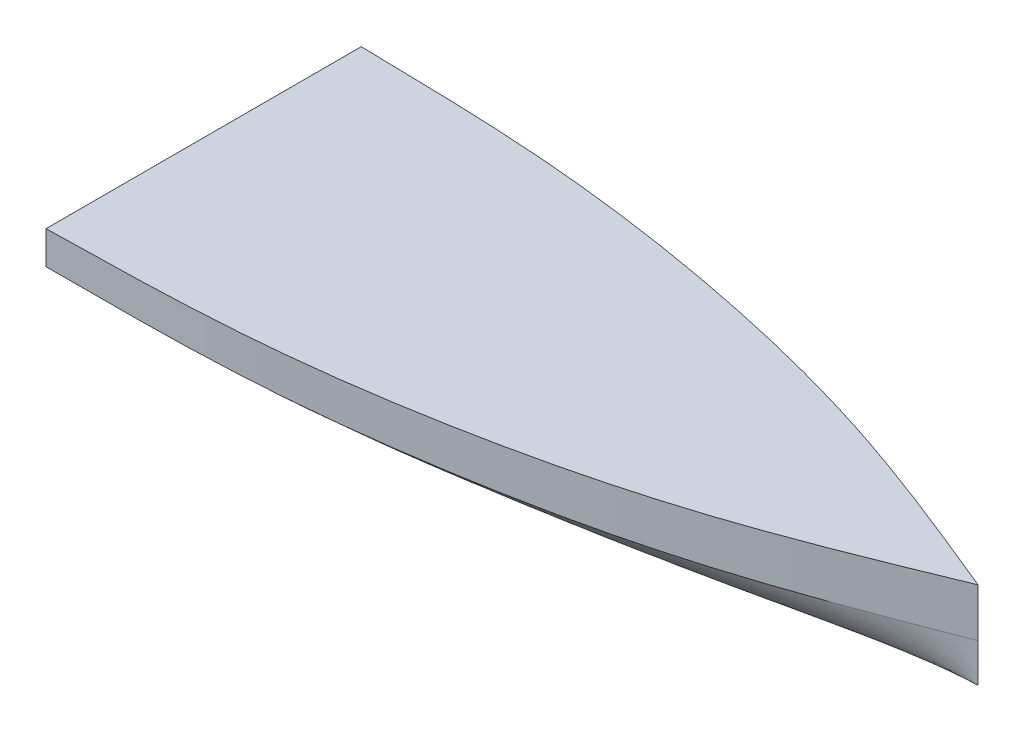
ISO-10303-21;
HEADER;
FILE_DESCRIPTION(('STEP AP214'),'2;1');
FILE_NAME('part.step','',(''),(''),'','','');
FILE_SCHEMA(('AUTOMOTIVE_DESIGN { 1 0 10303 214 1 1 1 1 }'));
ENDSEC;
DATA;
#1=APPLICATION_CONTEXT('core data for automotive mechanical design processes');
#2=APPLICATION_PROTOCOL_DEFINITION('international standard','automotive_design',2000,#1);
#3=PRODUCT_CONTEXT('',#1,'mechanical');
#4=PRODUCT('Part','Part','',(#3));
#5=PRODUCT_RELATED_PRODUCT_CATEGORY('part','',(#4));
#6=PRODUCT_DEFINITION_FORMATION('','',#4);
#7=PRODUCT_DEFINITION_CONTEXT('part definition',#1,'design');
#8=PRODUCT_DEFINITION('design','',#6,#7);
#9=PRODUCT_DEFINITION_SHAPE('','',#8);
#10=(LENGTH_UNIT() NAMED_UNIT(*) SI_UNIT(.MILLI.,.METRE.));
#11=(NAMED_UNIT(*) PLANE_ANGLE_UNIT() SI_UNIT($,.RADIAN.));
#12=(NAMED_UNIT(*) SI_UNIT($,.STERADIAN.) SOLID_ANGLE_UNIT());
#13=UNCERTAINTY_MEASURE_WITH_UNIT(LENGTH_MEASURE(1.E-05),#10,'distance_accuracy_value','');
#14=(GEOMETRIC_REPRESENTATION_CONTEXT(3) GLOBAL_UNCERTAINTY_ASSIGNED_CONTEXT((#13)) GLOBAL_UNIT_ASSIGNED_CONTEXT((#10,
#11,#12)) REPRESENTATION_CONTEXT('',''));
#15=CARTESIAN_POINT('',(0.,0.,0.));
#16=DIRECTION('',(0.,0.,1.));
#17=DIRECTION('',(1.,0.,0.));
#18=AXIS2_PLACEMENT_3D('',#15,#16,#17);
#19=CARTESIAN_POINT('',(-150.,0.,-81.405771285938));
#20=DIRECTION('',(0.,1.,0.));
#21=DIRECTION('',(0.,0.,1.));
#22=AXIS2_PLACEMENT_3D('',#19,#20,#21);
#23=PLANE('',#22);
#24=DIRECTION('',(0.,0.,1.));
#25=VECTOR('',#24,1.);
#26=CARTESIAN_POINT('',(-150.,0.,0.));
#27=LINE('',#26,#25);
#28=CARTESIAN_POINT('',(-150.,0.,-81.405771285938));
#29=VERTEX_POINT('',#28);
#30=CARTESIAN_POINT('',(-150.,0.,81.405771285938));
#31=VERTEX_POINT('',#30);
#32=EDGE_CURVE('E12',#29,#31,#27,.T.);
#33=ORIENTED_EDGE('',*,*,#32,.T.);
#34=CARTESIAN_POINT('',(-150.,0.,81.405771285938));
#35=CARTESIAN_POINT('',(-116.638846737262,0.,80.8095738798847));
#36=CARTESIAN_POINT('',(-49.7427742053213,0.,79.6140736942469));
#37=CARTESIAN_POINT('',(50.6317027871444,0.,65.3499909791472));
#38=CARTESIAN_POINT('',(151.227954208533,0.,40.5691423295299));
#39=CARTESIAN_POINT('',(216.774855827415,0.,13.6494309993884));
#40=CARTESIAN_POINT('',(249.9,0.,0.0451370225326153));
#41=B_SPLINE_CURVE_WITH_KNOTS('',3,(#34,#35,#36,#37,#38,#39,#40),.UNSPECIFIED.,.F.,.F.,(4,1,1,1,
4),(0.,0.246022042488694,0.493325523526259,0.743944188554489,1.),.UNSPECIFIED.);
#42=CARTESIAN_POINT('',(249.9,0.,0.0451370225326153));
#43=VERTEX_POINT('',#42);
#44=EDGE_CURVE('E179',#31,#43,#41,.T.);
#45=ORIENTED_EDGE('',*,*,#44,.T.);
#46=DIRECTION('',(0.,0.,1.));
#47=VECTOR('',#46,1.);
#48=CARTESIAN_POINT('',(249.9,0.,0.));
#49=LINE('',#48,#47);
#50=CARTESIAN_POINT('',(249.9,0.,-0.0451370225326153));
#51=VERTEX_POINT('',#50);
#52=EDGE_CURVE('E230',#51,#43,#49,.T.);
#53=ORIENTED_EDGE('',*,*,#52,.F.);
#54=CARTESIAN_POINT('',(-150.,0.,-81.405771285938));
#55=CARTESIAN_POINT('',(-116.638846737262,0.,-80.8095738798847));
#56=CARTESIAN_POINT('',(-49.7427742053213,0.,-79.6140736942469));
#57=CARTESIAN_POINT('',(50.6317027871444,0.,-65.3499909791472));
#58=CARTESIAN_POINT('',(151.227954208533,0.,-40.5691423295299));
#59=CARTESIAN_POINT('',(216.774855827415,0.,-13.6494309993884));
#60=CARTESIAN_POINT('',(249.9,0.,-0.0451370225326153));
#61=B_SPLINE_CURVE_WITH_KNOTS('',3,(#54,#55,#56,#57,#58,#59,#60),.UNSPECIFIED.,.F.,.F.,(4,1,1,1,
4),(0.,0.246022042488694,0.493325523526259,0.743944188554489,1.),.UNSPECIFIED.);
#62=EDGE_CURVE('E327',#29,#51,#61,.T.);
#63=ORIENTED_EDGE('',*,*,#62,.F.);
#64=EDGE_LOOP('',(#33,#45,#53,#63));
#65=FACE_BOUND('',#64,.T.);
#66=ADVANCED_FACE('F167',(#65),#23,.T.);
#67=CARTESIAN_POINT('',(-150.,0.,81.405771285938));
#68=CARTESIAN_POINT('',(-116.638846737262,0.,80.8095738798847));
#69=CARTESIAN_POINT('',(-49.7427742053213,0.,79.6140736942469));
#70=CARTESIAN_POINT('',(50.6317027871444,0.,65.3499909791472));
#71=CARTESIAN_POINT('',(151.227954208533,0.,40.5691423295299));
#72=CARTESIAN_POINT('',(216.774855827415,0.,13.6494309993884));
#73=CARTESIAN_POINT('',(249.9,0.,0.0451370225326153));
#74=CARTESIAN_POINT('',(-150.,-17.,81.405771285938));
#75=CARTESIAN_POINT('',(-116.638846737262,-17.6672118608523,80.8095738798847));
#76=CARTESIAN_POINT('',(-49.7427742053213,-19.0051108443265,79.6140736942469));
#77=CARTESIAN_POINT('',(50.6317027871444,-21.0127703181343,65.3499909791472));
#78=CARTESIAN_POINT('',(151.227954208533,-23.0240357792725,40.5691423295299));
#79=CARTESIAN_POINT('',(216.774855827415,-24.3366500190966,13.6494309993884));
#80=CARTESIAN_POINT('',(249.9,-25.,0.0451370225326123));
#81=B_SPLINE_SURFACE_WITH_KNOTS('',1,3,((#67,#68,#69,#70,#71,#72,#73),(#74,#75,#76,#77,#78,#79,
#80)),.UNSPECIFIED.,.F.,.F.,.F.,(2,2),(4,1,1,1,4),(0.,1.),(0.,0.246022042488694,
0.493325523526259,0.743944188554489,1.),.UNSPECIFIED.);
#82=DIRECTION('',(0.,-1.,0.));
#83=VECTOR('',#82,1.);
#84=CARTESIAN_POINT('',(-150.,-8.5,81.405771285938));
#85=LINE('',#84,#83);
#86=CARTESIAN_POINT('',(-150.,-17.,81.405771285938));
#87=VERTEX_POINT('',#86);
#88=EDGE_CURVE('E188',#31,#87,#85,.T.);
#89=CARTESIAN_POINT('',(-150.,-17.,81.405771285938));
#90=CARTESIAN_POINT('',(-116.638846737262,-17.6672118608523,80.8095738798847));
#91=CARTESIAN_POINT('',(-49.7427742053213,-19.0051108443265,79.6140736942468));
#92=CARTESIAN_POINT('',(50.6317027871444,-21.0127703181343,65.3499909791472));
#93=CARTESIAN_POINT('',(151.227954208533,-23.0240357792725,40.5691423295298));
#94=CARTESIAN_POINT('',(216.774855827415,-24.3366500190966,13.6494309993884));
#95=CARTESIAN_POINT('',(249.9,-25.,0.0451370225326122));
#96=B_SPLINE_CURVE_WITH_KNOTS('',3,(#89,#90,#91,#92,#93,#94,#95),.UNSPECIFIED.,.F.,.F.,(4,1,1,1,
4),(0.,0.246022042488694,0.493325523526259,0.743944188554489,1.),.UNSPECIFIED.);
#97=CARTESIAN_POINT('',(249.9,-25.,0.0451370225326122));
#98=VERTEX_POINT('',#97);
#99=EDGE_CURVE('E214',#87,#98,#96,.T.);
#100=DIRECTION('',(0.,-1.,0.));
#101=VECTOR('',#100,1.);
#102=CARTESIAN_POINT('',(249.9,-12.5,0.0451370225326138));
#103=LINE('',#102,#101);
#104=EDGE_CURVE('E221',#43,#98,#103,.T.);
#105=ORIENTED_EDGE('',*,*,#88,.T.);
#106=ORIENTED_EDGE('',*,*,#99,.T.);
#107=ORIENTED_EDGE('',*,*,#104,.F.);
#108=ORIENTED_EDGE('',*,*,#44,.F.);
#109=EDGE_LOOP('',(#105,#106,#107,#108));
#110=FACE_BOUND('',#109,.T.);
#111=ADVANCED_FACE('F240',(#110),#81,.T.);
#112=CARTESIAN_POINT('',(-150.,-17.,81.405771285938));
#113=CARTESIAN_POINT('',(-116.638846737262,-17.6672118608523,80.8095738798847));
#114=CARTESIAN_POINT('',(-49.7427742053213,-19.0051108443265,79.6140736942468));
#115=CARTESIAN_POINT('',(50.6317027871444,-21.0127703181343,65.3499909791472));
#116=CARTESIAN_POINT('',(151.227954208533,-23.0240357792725,40.5691423295298));
#117=CARTESIAN_POINT('',(216.774855827415,-24.3366500190966,13.6494309993884));
#118=CARTESIAN_POINT('',(249.9,-25.,0.0451370225326122));
#119=CARTESIAN_POINT('',(-150.,-21.8051540860384,75.7963536954995));
#120=CARTESIAN_POINT('',(-116.638846737262,-22.5655101612967,75.3244737477681));
#121=CARTESIAN_POINT('',(-49.7427742053213,-24.0901827276193,74.3782560027998));
#122=CARTESIAN_POINT('',(50.6317027871444,-25.3526769380671,60.9130466986286));
#123=CARTESIAN_POINT('',(151.227954208533,-26.3707911350128,39.0705039634522));
#124=CARTESIAN_POINT('',(216.774855827415,-27.7472853242932,13.1463238474013));
#125=CARTESIAN_POINT('',(249.9,-28.4429180292189,0.0451370225326118));
#126=CARTESIAN_POINT('',(-150.,-30.4196988845977,63.7246782220816));
#127=CARTESIAN_POINT('',(-116.638846737262,-31.3659657699669,63.4502856806367));
#128=CARTESIAN_POINT('',(-49.7427742053213,-33.2634282977069,62.9000713876785));
#129=CARTESIAN_POINT('',(50.6317027871446,-33.106174464079,51.2985487065188));
#130=CARTESIAN_POINT('',(151.227954208533,-32.7893086977552,34.7857992726971));
#131=CARTESIAN_POINT('',(216.774855827415,-33.8681584780577,11.7060337279786));
#132=CARTESIAN_POINT('',(249.9,-34.4133719607769,0.0423159586243231));
#133=CARTESIAN_POINT('',(-150.,-39.9491696874336,43.6235895569039));
#134=CARTESIAN_POINT('',(-116.638846737262,-41.1292967625243,43.5175237114742));
#135=CARTESIAN_POINT('',(-49.7427742053211,-43.4956977616275,43.3048395625438));
#136=CARTESIAN_POINT('',(50.6317027871442,-41.6370640720175,35.1670631615842));
#137=CARTESIAN_POINT('',(151.227954208534,-40.5287833395358,25.1330207184538));
#138=CARTESIAN_POINT('',(216.774855827415,-40.6321518122783,8.45847664431594));
#139=CARTESIAN_POINT('',(249.9,-40.6843906744964,0.0317369689682422));
#140=CARTESIAN_POINT('',(-150.,-45.7889049113112,22.1583537592279));
#141=CARTESIAN_POINT('',(-116.638846737262,-47.1240890131779,22.1291663050477));
#142=CARTESIAN_POINT('',(-49.7427742053214,-49.8014117009921,22.0706393699479));
#143=CARTESIAN_POINT('',(50.6317027871445,-46.8411508509107,17.8763287205671));
#144=CARTESIAN_POINT('',(151.227954208534,-45.5486295254136,13.1697217970133));
#145=CARTESIAN_POINT('',(216.774855827415,-44.7405878200843,4.43244489076427));
#146=CARTESIAN_POINT('',(249.9,-44.3322314016204,0.0169263834497292));
#147=CARTESIAN_POINT('',(-150.,-47.7559083208649,0.));
#148=CARTESIAN_POINT('',(-116.638846737262,-49.1459003431606,0.));
#149=CARTESIAN_POINT('',(-49.7427742053212,-51.9331243461798,0.));
#150=CARTESIAN_POINT('',(50.6317027871444,-48.5824626978723,0.));
#151=CARTESIAN_POINT('',(151.227954208533,-47.3149233158318,0.));
#152=CARTESIAN_POINT('',(216.774855827415,-46.0550665245405,0.));
#153=CARTESIAN_POINT('',(249.9,-45.4183783391708,0.));
#154=CARTESIAN_POINT('',(-150.,-45.7889049113112,-22.1583537592281));
#155=CARTESIAN_POINT('',(-116.638846737262,-47.1259260630216,-22.1291663050479));
#156=CARTESIAN_POINT('',(-49.7427742053212,-49.8069324190415,-22.0706393699482));
#157=CARTESIAN_POINT('',(50.631702787144,-46.8188095609941,-17.8763287205673));
#158=CARTESIAN_POINT('',(151.227954208535,-45.6344294759758,-13.1697217970134));
#159=CARTESIAN_POINT('',(216.774855827415,-44.5515603869442,-4.43244489076432));
#160=CARTESIAN_POINT('',(249.9,-44.0043156841697,-0.0169263834497295));
#161=CARTESIAN_POINT('',(-150.,-39.9491696874333,-43.6235895569039));
#162=CARTESIAN_POINT('',(-116.638846737262,-41.13228196852,-43.5175237114741));
#163=CARTESIAN_POINT('',(-49.7427742053215,-43.5046689284581,-43.3048395625436));
#164=CARTESIAN_POINT('',(50.6317027871449,-41.6007594759027,-35.1670631615843));
#165=CARTESIAN_POINT('',(151.227954208532,-40.6682082591992,-25.1330207184536));
#166=CARTESIAN_POINT('',(216.774855827415,-40.3249822334255,-8.45847664431589));
#167=CARTESIAN_POINT('',(249.9,-40.1515276336391,-0.0317369689682436));
#168=CARTESIAN_POINT('',(-150.,-30.4196988845977,-63.7246782220818));
#169=CARTESIAN_POINT('',(-116.638846737262,-31.3687213447323,-63.4502856806368));
#170=CARTESIAN_POINT('',(-49.7427742053211,-33.2717093747809,-62.9000713876787));
#171=CARTESIAN_POINT('',(50.631702787144,-33.072662529204,-51.298548706519));
#172=CARTESIAN_POINT('',(151.227954208534,-32.9180086235985,-34.7857992726972));
#173=CARTESIAN_POINT('',(216.774855827415,-33.5846173283475,-11.7060337279786));
#174=CARTESIAN_POINT('',(249.9,-33.921498384601,-0.0423159586243264));
#175=CARTESIAN_POINT('',(-150.,-21.8051540860384,-75.7963536954995));
#176=CARTESIAN_POINT('',(-116.638846737262,-22.5667348611924,-75.3244737477681));
#177=CARTESIAN_POINT('',(-49.7427742053213,-24.0938632063189,-74.3782560027999));
#178=CARTESIAN_POINT('',(50.6317027871444,-25.3377827447892,-60.9130466986286));
#179=CARTESIAN_POINT('',(151.227954208533,-26.4279911020543,-39.0705039634522));
#180=CARTESIAN_POINT('',(216.774855827415,-27.6212670355331,-13.1463238474013));
#181=CARTESIAN_POINT('',(249.9,-28.2243075509185,-0.0451370225326169));
#182=CARTESIAN_POINT('',(-150.,-17.,-81.405771285938));
#183=CARTESIAN_POINT('',(-116.638846737262,-17.6672118608522,-80.8095738798847));
#184=CARTESIAN_POINT('',(-49.7427742053213,-19.0051108443264,-79.614073694247));
#185=CARTESIAN_POINT('',(50.6317027871444,-21.0127703181342,-65.3499909791472));
#186=CARTESIAN_POINT('',(151.227954208533,-23.0240357792725,-40.5691423295299));
#187=CARTESIAN_POINT('',(216.774855827415,-24.3366500190966,-13.6494309993884));
#188=CARTESIAN_POINT('',(249.9,-25.,-0.0451370225326184));
#189=B_SPLINE_SURFACE_WITH_KNOTS('',3,3,((#112,#113,#114,#115,#116,#117,#118),(#119,#120,#121,
#122,#123,#124,#125),(#126,#127,#128,#129,#130,#131,#132),(#133,#134,#135,#136,#137,#138,#139),
(#140,#141,#142,#143,#144,#145,#146),(#147,#148,#149,#150,#151,#152,#153),(#154,#155,#156,#157,
#158,#159,#160),(#161,#162,#163,#164,#165,#166,#167),(#168,#169,#170,#171,#172,#173,#174),(#175,
#176,#177,#178,#179,#180,#181),(#182,#183,#184,#185,#186,#187,#188)),.UNSPECIFIED.,.F.,.F.,.F.,
(4,1,1,1,1,1,1,1,4),(4,1,1,1,4),(0.,0.125,0.25,0.375,0.5,0.625,0.75,0.875,1.),(0.,
0.246022042488694,0.493325523526259,0.743944188554489,1.),.UNSPECIFIED.);
#190=CARTESIAN_POINT('',(-150.,78.0310764729347,0.));
#191=DIRECTION('',(1.,0.,0.));
#192=DIRECTION('',(0.,0.,1.));
#193=AXIS2_PLACEMENT_3D('',#190,#191,#192);
#194=CIRCLE('',#193,125.131151574111);
#195=CARTESIAN_POINT('',(-150.,-17.,-81.405771285938));
#196=VERTEX_POINT('',#195);
#197=EDGE_CURVE('E242',#87,#196,#194,.T.);
#198=CARTESIAN_POINT('',(-150.,-17.,-81.405771285938));
#199=CARTESIAN_POINT('',(-116.638846737262,-17.6672118608522,-80.8095738798847));
#200=CARTESIAN_POINT('',(-49.7427742053213,-19.0051108443264,-79.6140736942469));
#201=CARTESIAN_POINT('',(50.6317027871444,-21.0127703181342,-65.3499909791472));
#202=CARTESIAN_POINT('',(151.227954208533,-23.0240357792725,-40.5691423295299));
#203=CARTESIAN_POINT('',(216.774855827415,-24.3366500190966,-13.6494309993884));
#204=CARTESIAN_POINT('',(249.9,-25.,-0.0451370225326184));
#205=B_SPLINE_CURVE_WITH_KNOTS('',3,(#198,#199,#200,#201,#202,#203,#204),.UNSPECIFIED.,.F.,.F.,
(4,1,1,1,4),(0.,0.246022042488694,0.493325523526259,0.743944188554489,1.),.UNSPECIFIED.);
#206=CARTESIAN_POINT('',(249.9,-25.,-0.0451370225326184));
#207=VERTEX_POINT('',#206);
#208=EDGE_CURVE('E217',#196,#207,#205,.T.);
#209=CARTESIAN_POINT('',(249.9,-25.,0.0451370225326122));
#210=CARTESIAN_POINT('',(249.9,-28.4429180292189,0.0451370225326118));
#211=CARTESIAN_POINT('',(249.9,-34.4133719607769,0.0423159586243231));
#212=CARTESIAN_POINT('',(249.9,-40.6843906744964,0.0317369689682422));
#213=CARTESIAN_POINT('',(249.9,-44.3322314016204,0.0169263834497292));
#214=CARTESIAN_POINT('',(249.9,-45.4183783391708,0.));
#215=CARTESIAN_POINT('',(249.9,-44.0043156841697,-0.0169263834497295));
#216=CARTESIAN_POINT('',(249.9,-40.1515276336391,-0.0317369689682436));
#217=CARTESIAN_POINT('',(249.9,-33.921498384601,-0.0423159586243264));
#218=CARTESIAN_POINT('',(249.9,-28.2243075509185,-0.0451370225326169));
#219=CARTESIAN_POINT('',(249.9,-25.,-0.0451370225326184));
#220=B_SPLINE_CURVE_WITH_KNOTS('',3,(#209,#210,#211,#212,#213,#214,#215,#216,#217,#218,#219),
.UNSPECIFIED.,.F.,.F.,(4,1,1,1,1,1,1,1,4),(0.,0.125,0.25,0.375,0.5,0.625,0.75,0.875,1.),.UNSPECIFIED.);
#221=EDGE_CURVE('E208',#98,#207,#220,.T.);
#222=ORIENTED_EDGE('',*,*,#197,.T.);
#223=ORIENTED_EDGE('',*,*,#208,.T.);
#224=ORIENTED_EDGE('',*,*,#221,.F.);
#225=ORIENTED_EDGE('',*,*,#99,.F.);
#226=EDGE_LOOP('',(#222,#223,#224,#225));
#227=FACE_BOUND('',#226,.T.);
#228=ADVANCED_FACE('F212',(#227),#189,.T.);
#229=CARTESIAN_POINT('',(-150.,-17.,-81.405771285938));
#230=CARTESIAN_POINT('',(-116.638846737262,-17.6672118608522,-80.8095738798847));
#231=CARTESIAN_POINT('',(-49.7427742053213,-19.0051108443264,-79.6140736942469));
#232=CARTESIAN_POINT('',(50.6317027871444,-21.0127703181342,-65.3499909791472));
#233=CARTESIAN_POINT('',(151.227954208533,-23.0240357792725,-40.5691423295299));
#234=CARTESIAN_POINT('',(216.774855827415,-24.3366500190966,-13.6494309993884));
#235=CARTESIAN_POINT('',(249.9,-25.,-0.0451370225326184));
#236=CARTESIAN_POINT('',(-150.,0.,-81.405771285938));
#237=CARTESIAN_POINT('',(-116.638846737262,0.,-80.8095738798847));
#238=CARTESIAN_POINT('',(-49.7427742053213,0.,-79.6140736942469));
#239=CARTESIAN_POINT('',(50.6317027871444,0.,-65.3499909791472));
#240=CARTESIAN_POINT('',(151.227954208533,0.,-40.5691423295299));
#241=CARTESIAN_POINT('',(216.774855827415,0.,-13.6494309993884));
#242=CARTESIAN_POINT('',(249.9,0.,-0.0451370225326153));
#243=B_SPLINE_SURFACE_WITH_KNOTS('',1,3,((#229,#230,#231,#232,#233,#234,#235),(#236,#237,#238,
#239,#240,#241,#242)),.UNSPECIFIED.,.F.,.F.,.F.,(2,2),(4,1,1,1,4),(0.,1.),(0.,0.246022042488694,
0.493325523526259,0.743944188554489,1.),.UNSPECIFIED.);
#244=DIRECTION('',(0.,1.,0.));
#245=VECTOR('',#244,1.);
#246=CARTESIAN_POINT('',(-150.,-8.49999999999998,-81.405771285938));
#247=LINE('',#246,#245);
#248=EDGE_CURVE('E338',#196,#29,#247,.T.);
#249=DIRECTION('',(0.,1.,0.));
#250=VECTOR('',#249,1.);
#251=CARTESIAN_POINT('',(249.9,-12.5,-0.0451370225326168));
#252=LINE('',#251,#250);
#253=EDGE_CURVE('E222',#207,#51,#252,.T.);
#254=ORIENTED_EDGE('',*,*,#248,.T.);
#255=ORIENTED_EDGE('',*,*,#62,.T.);
#256=ORIENTED_EDGE('',*,*,#253,.F.);
#257=ORIENTED_EDGE('',*,*,#208,.F.);
#258=EDGE_LOOP('',(#254,#255,#256,#257));
#259=FACE_BOUND('',#258,.T.);
#260=ADVANCED_FACE('F324',(#259),#243,.T.);
#261=CARTESIAN_POINT('',(-150.,78.0310764729347,0.));
#262=DIRECTION('',(1.,0.,0.));
#263=DIRECTION('',(0.,0.,-1.));
#264=AXIS2_PLACEMENT_3D('',#261,#262,#263);
#265=PLANE('',#264);
#266=ORIENTED_EDGE('',*,*,#248,.F.);
#267=ORIENTED_EDGE('',*,*,#197,.F.);
#268=ORIENTED_EDGE('',*,*,#88,.F.);
#269=ORIENTED_EDGE('',*,*,#32,.F.);
#270=EDGE_LOOP('',(#266,#267,#268,#269));
#271=FACE_BOUND('',#270,.T.);
#272=ADVANCED_FACE('F295',(#271),#265,.F.);
#273=CARTESIAN_POINT('',(249.9,-45.0016767404122,0.));
#274=DIRECTION('',(-1.,0.,0.));
#275=DIRECTION('',(0.,0.,1.));
#276=AXIS2_PLACEMENT_3D('',#273,#274,#275);
#277=PLANE('',#276);
#278=ORIENTED_EDGE('',*,*,#52,.T.);
#279=ORIENTED_EDGE('',*,*,#104,.T.);
#280=ORIENTED_EDGE('',*,*,#221,.T.);
#281=ORIENTED_EDGE('',*,*,#253,.T.);
#282=EDGE_LOOP('',(#278,#279,#280,#281));
#283=FACE_BOUND('',#282,.T.);
#284=ADVANCED_FACE('F228',(#283),#277,.F.);
#285=CLOSED_SHELL('',(#66,#111,#228,#260,#272,#284));
#286=MANIFOLD_SOLID_BREP('B2',#285);
#287=ADVANCED_BREP_SHAPE_REPRESENTATION('',(#18,#286),#14);
#288=SHAPE_DEFINITION_REPRESENTATION(#9,#287);
ENDSEC;
END-ISO-10303-21;
